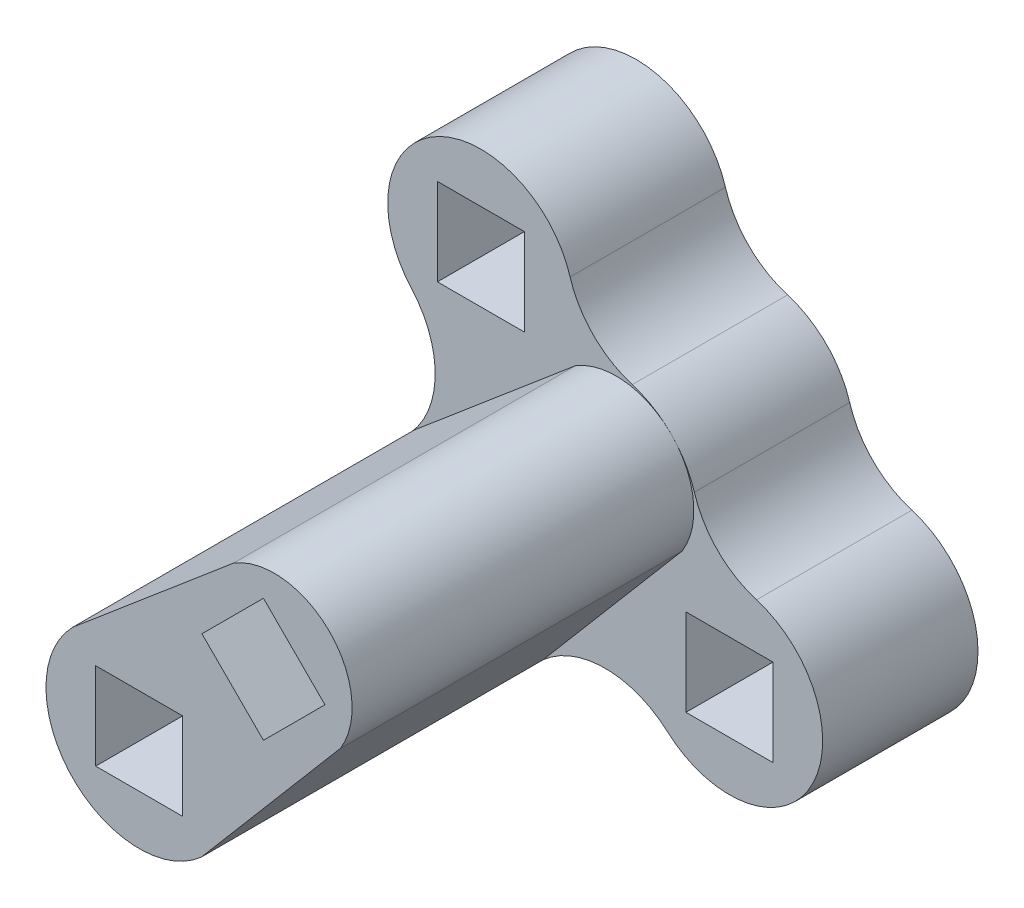
ISO-10303-21;
HEADER;
FILE_DESCRIPTION(('STEP AP214'),'2;1');
FILE_NAME('part.step','',(''),(''),'','','');
FILE_SCHEMA(('AUTOMOTIVE_DESIGN { 1 0 10303 214 1 1 1 1 }'));
ENDSEC;
DATA;
#1=APPLICATION_CONTEXT('core data for automotive mechanical design processes');
#2=APPLICATION_PROTOCOL_DEFINITION('international standard','automotive_design',2000,#1);
#3=PRODUCT_CONTEXT('',#1,'mechanical');
#4=PRODUCT('Part','Part','',(#3));
#5=PRODUCT_RELATED_PRODUCT_CATEGORY('part','',(#4));
#6=PRODUCT_DEFINITION_FORMATION('','',#4);
#7=PRODUCT_DEFINITION_CONTEXT('part definition',#1,'design');
#8=PRODUCT_DEFINITION('design','',#6,#7);
#9=PRODUCT_DEFINITION_SHAPE('','',#8);
#10=(LENGTH_UNIT() NAMED_UNIT(*) SI_UNIT(.MILLI.,.METRE.));
#11=(NAMED_UNIT(*) PLANE_ANGLE_UNIT() SI_UNIT($,.RADIAN.));
#12=(NAMED_UNIT(*) SI_UNIT($,.STERADIAN.) SOLID_ANGLE_UNIT());
#13=UNCERTAINTY_MEASURE_WITH_UNIT(LENGTH_MEASURE(1.E-05),#10,'distance_accuracy_value','');
#14=(GEOMETRIC_REPRESENTATION_CONTEXT(3) GLOBAL_UNCERTAINTY_ASSIGNED_CONTEXT((#13)) GLOBAL_UNIT_ASSIGNED_CONTEXT((#10,
#11,#12)) REPRESENTATION_CONTEXT('',''));
#15=CARTESIAN_POINT('',(0.,0.,0.));
#16=DIRECTION('',(0.,0.,1.));
#17=DIRECTION('',(1.,0.,0.));
#18=AXIS2_PLACEMENT_3D('',#15,#16,#17);
#19=CARTESIAN_POINT('',(2.,-2.23606797749979,16.));
#20=DIRECTION('',(0.,0.,1.));
#21=DIRECTION('',(1.,0.,0.));
#22=AXIS2_PLACEMENT_3D('',#19,#20,#21);
#23=PLANE('',#22);
#24=DIRECTION('',(-0.707106781186549,0.707106781186546,0.));
#25=VECTOR('',#24,1.);
#26=CARTESIAN_POINT('',(4.,5.97989898732234,16.));
#27=LINE('',#26,#25);
#28=CARTESIAN_POINT('',(5.97989898732233,4.00000000000001,16.));
#29=VERTEX_POINT('',#28);
#30=CARTESIAN_POINT('',(4.,5.97989898732234,16.));
#31=VERTEX_POINT('',#30);
#32=EDGE_CURVE('E409',#29,#31,#27,.T.);
#33=ORIENTED_EDGE('',*,*,#32,.F.);
#34=DIRECTION('',(0.707106781186546,0.707106781186549,0.));
#35=VECTOR('',#34,1.);
#36=CARTESIAN_POINT('',(4.,2.02010101267767,16.));
#37=LINE('',#36,#35);
#38=CARTESIAN_POINT('',(4.,2.02010101267767,16.));
#39=VERTEX_POINT('',#38);
#40=EDGE_CURVE('E407',#39,#29,#37,.T.);
#41=ORIENTED_EDGE('',*,*,#40,.F.);
#42=DIRECTION('',(0.707106781186549,-0.707106781186546,0.));
#43=VECTOR('',#42,1.);
#44=CARTESIAN_POINT('',(2.02010101267767,4.,16.));
#45=LINE('',#44,#43);
#46=CARTESIAN_POINT('',(2.02010101267767,4.,16.));
#47=VERTEX_POINT('',#46);
#48=EDGE_CURVE('E415',#47,#39,#45,.T.);
#49=ORIENTED_EDGE('',*,*,#48,.F.);
#50=DIRECTION('',(-0.707106781186546,-0.707106781186549,0.));
#51=VECTOR('',#50,1.);
#52=CARTESIAN_POINT('',(2.02010101267767,4.,16.));
#53=LINE('',#52,#51);
#54=EDGE_CURVE('E412',#31,#47,#53,.T.);
#55=ORIENTED_EDGE('',*,*,#54,.F.);
#56=EDGE_LOOP('',(#33,#41,#49,#55));
#57=FACE_BOUND('',#56,.T.);
#58=DIRECTION('',(0.,1.,0.));
#59=VECTOR('',#58,1.);
#60=CARTESIAN_POINT('',(1.4,1.4,16.));
#61=LINE('',#60,#59);
#62=CARTESIAN_POINT('',(1.4,-1.4,16.));
#63=VERTEX_POINT('',#62);
#64=CARTESIAN_POINT('',(1.4,1.4,16.));
#65=VERTEX_POINT('',#64);
#66=EDGE_CURVE('E358',#63,#65,#61,.T.);
#67=ORIENTED_EDGE('',*,*,#66,.F.);
#68=DIRECTION('',(1.,0.,0.));
#69=VECTOR('',#68,1.);
#70=CARTESIAN_POINT('',(-1.4,-1.4,16.));
#71=LINE('',#70,#69);
#72=CARTESIAN_POINT('',(-1.4,-1.4,16.));
#73=VERTEX_POINT('',#72);
#74=EDGE_CURVE('E356',#73,#63,#71,.T.);
#75=ORIENTED_EDGE('',*,*,#74,.F.);
#76=DIRECTION('',(0.,-1.,0.));
#77=VECTOR('',#76,1.);
#78=CARTESIAN_POINT('',(-1.4,1.4,16.));
#79=LINE('',#78,#77);
#80=CARTESIAN_POINT('',(-1.4,1.4,16.));
#81=VERTEX_POINT('',#80);
#82=EDGE_CURVE('E364',#81,#73,#79,.T.);
#83=ORIENTED_EDGE('',*,*,#82,.F.);
#84=DIRECTION('',(-1.,0.,0.));
#85=VECTOR('',#84,1.);
#86=CARTESIAN_POINT('',(-1.4,1.4,16.));
#87=LINE('',#86,#85);
#88=EDGE_CURVE('E361',#65,#81,#87,.T.);
#89=ORIENTED_EDGE('',*,*,#88,.F.);
#90=EDGE_LOOP('',(#67,#75,#83,#89));
#91=FACE_BOUND('',#90,.T.);
#92=DIRECTION('',(-0.763726121624456,-0.645540402413719,0.));
#93=VECTOR('',#92,1.);
#94=CARTESIAN_POINT('',(3.04273657005169,6.48234630278207,16.));
#95=LINE('',#94,#93);
#96=CARTESIAN_POINT('',(3.04273657005169,6.48234630278207,16.));
#97=VERTEX_POINT('',#96);
#98=CARTESIAN_POINT('',(-2.14481671323412,2.0975607897345,16.));
#99=VERTEX_POINT('',#98);
#100=EDGE_CURVE('E498',#97,#99,#95,.T.);
#101=ORIENTED_EDGE('',*,*,#100,.T.);
#102=CARTESIAN_POINT('',(0.,0.,16.));
#103=DIRECTION('',(0.,0.,1.));
#104=DIRECTION('',(1.,0.,0.));
#105=AXIS2_PLACEMENT_3D('',#102,#103,#104);
#106=CIRCLE('',#105,3.);
#107=CARTESIAN_POINT('',(2.,-2.23606797749979,16.));
#108=VERTEX_POINT('',#107);
#109=EDGE_CURVE('E276',#99,#108,#106,.T.);
#110=ORIENTED_EDGE('',*,*,#109,.T.);
#111=DIRECTION('',(0.647457578645489,0.762101491833286,0.));
#112=VECTOR('',#111,1.);
#113=CARTESIAN_POINT('',(2.,-2.23606797749979,16.));
#114=LINE('',#113,#112);
#115=CARTESIAN_POINT('',(6.47600505006758,3.03249360648251,16.));
#116=VERTEX_POINT('',#115);
#117=EDGE_CURVE('E247',#108,#116,#114,.T.);
#118=ORIENTED_EDGE('',*,*,#117,.T.);
#119=CARTESIAN_POINT('',(4.35355339059327,4.35355339059328,16.));
#120=DIRECTION('',(0.,0.,1.));
#121=DIRECTION('',(1.,0.,0.));
#122=AXIS2_PLACEMENT_3D('',#119,#120,#121);
#123=CIRCLE('',#122,2.5);
#124=EDGE_CURVE('E496',#116,#97,#123,.T.);
#125=ORIENTED_EDGE('',*,*,#124,.T.);
#126=EDGE_LOOP('',(#101,#110,#118,#125));
#127=FACE_BOUND('',#126,.T.);
#128=ADVANCED_FACE('F58',(#57,#91,#127),#23,.T.);
#129=CARTESIAN_POINT('',(4.,-4.47213595499958,16.));
#130=DIRECTION('',(0.,0.,-1.));
#131=DIRECTION('',(-1.,0.,0.));
#132=AXIS2_PLACEMENT_3D('',#129,#130,#131);
#133=CYLINDRICAL_SURFACE('',#132,3.);
#134=CARTESIAN_POINT('',(4.,-4.47213595499958,5.));
#135=DIRECTION('',(0.,0.,1.));
#136=DIRECTION('',(1.,0.,0.));
#137=AXIS2_PLACEMENT_3D('',#134,#135,#136);
#138=CIRCLE('',#137,3.);
#139=CARTESIAN_POINT('',(2.,-2.23606797749979,5.));
#140=VERTEX_POINT('',#139);
#141=CARTESIAN_POINT('',(6.,-2.23606797749979,5.));
#142=VERTEX_POINT('',#141);
#143=EDGE_CURVE('E257',#140,#142,#138,.F.);
#144=ORIENTED_EDGE('',*,*,#143,.F.);
#145=DIRECTION('',(0.,0.,-1.));
#146=VECTOR('',#145,1.);
#147=CARTESIAN_POINT('',(2.,-2.23606797749979,16.));
#148=LINE('',#147,#146);
#149=CARTESIAN_POINT('',(2.,-2.23606797749979,0.));
#150=VERTEX_POINT('',#149);
#151=EDGE_CURVE('E252',#140,#150,#148,.T.);
#152=ORIENTED_EDGE('',*,*,#151,.T.);
#153=CARTESIAN_POINT('',(4.,-4.47213595499958,0.));
#154=DIRECTION('',(0.,0.,-1.));
#155=DIRECTION('',(1.,0.,0.));
#156=AXIS2_PLACEMENT_3D('',#153,#154,#155);
#157=CIRCLE('',#156,3.);
#158=CARTESIAN_POINT('',(6.,-2.23606797749979,0.));
#159=VERTEX_POINT('',#158);
#160=EDGE_CURVE('E301',#150,#159,#157,.T.);
#161=ORIENTED_EDGE('',*,*,#160,.T.);
#162=DIRECTION('',(0.,0.,-1.));
#163=VECTOR('',#162,1.);
#164=CARTESIAN_POINT('',(6.,-2.23606797749979,16.));
#165=LINE('',#164,#163);
#166=EDGE_CURVE('E66',#142,#159,#165,.T.);
#167=ORIENTED_EDGE('',*,*,#166,.F.);
#168=EDGE_LOOP('',(#144,#152,#161,#167));
#169=FACE_BOUND('',#168,.T.);
#170=ADVANCED_FACE('F60',(#169),#133,.F.);
#171=CARTESIAN_POINT('',(8.,0.,16.));
#172=DIRECTION('',(0.,0.,-1.));
#173=DIRECTION('',(-1.,0.,0.));
#174=AXIS2_PLACEMENT_3D('',#171,#172,#173);
#175=CYLINDRICAL_SURFACE('',#174,3.);
#176=CARTESIAN_POINT('',(8.,0.,5.));
#177=DIRECTION('',(0.,0.,1.));
#178=DIRECTION('',(1.,0.,0.));
#179=AXIS2_PLACEMENT_3D('',#176,#177,#178);
#180=CIRCLE('',#179,3.);
#181=CARTESIAN_POINT('',(8.87082869338697,2.87082869338697,5.));
#182=VERTEX_POINT('',#181);
#183=EDGE_CURVE('E270',#142,#182,#180,.T.);
#184=ORIENTED_EDGE('',*,*,#183,.F.);
#185=ORIENTED_EDGE('',*,*,#166,.T.);
#186=CARTESIAN_POINT('',(8.,0.,0.));
#187=DIRECTION('',(0.,0.,1.));
#188=DIRECTION('',(1.,0.,0.));
#189=AXIS2_PLACEMENT_3D('',#186,#187,#188);
#190=CIRCLE('',#189,3.);
#191=CARTESIAN_POINT('',(8.87082869338697,2.87082869338697,0.));
#192=VERTEX_POINT('',#191);
#193=EDGE_CURVE('E296',#159,#192,#190,.T.);
#194=ORIENTED_EDGE('',*,*,#193,.T.);
#195=DIRECTION('',(0.,0.,-1.));
#196=VECTOR('',#195,1.);
#197=CARTESIAN_POINT('',(8.87082869338697,2.87082869338697,16.));
#198=LINE('',#197,#196);
#199=EDGE_CURVE('E290',#182,#192,#198,.T.);
#200=ORIENTED_EDGE('',*,*,#199,.F.);
#201=EDGE_LOOP('',(#184,#185,#194,#200));
#202=FACE_BOUND('',#201,.T.);
#203=ADVANCED_FACE('F294',(#202),#175,.T.);
#204=CARTESIAN_POINT('',(9.74165738677394,5.74165738677394,16.));
#205=DIRECTION('',(0.,0.,-1.));
#206=DIRECTION('',(-1.,0.,0.));
#207=AXIS2_PLACEMENT_3D('',#204,#205,#206);
#208=CYLINDRICAL_SURFACE('',#207,3.);
#209=CARTESIAN_POINT('',(9.74165738677394,5.74165738677394,5.));
#210=DIRECTION('',(0.,0.,1.));
#211=DIRECTION('',(1.,0.,0.));
#212=AXIS2_PLACEMENT_3D('',#209,#210,#211);
#213=CIRCLE('',#212,3.);
#214=CARTESIAN_POINT('',(6.87082869338697,4.87082869338697,5.));
#215=VERTEX_POINT('',#214);
#216=EDGE_CURVE('E349',#182,#215,#213,.F.);
#217=ORIENTED_EDGE('',*,*,#216,.F.);
#218=ORIENTED_EDGE('',*,*,#199,.T.);
#219=CARTESIAN_POINT('',(9.74165738677394,5.74165738677394,0.));
#220=DIRECTION('',(0.,0.,-1.));
#221=DIRECTION('',(1.,0.,0.));
#222=AXIS2_PLACEMENT_3D('',#219,#220,#221);
#223=CIRCLE('',#222,3.);
#224=CARTESIAN_POINT('',(6.87082869338697,4.87082869338697,0.));
#225=VERTEX_POINT('',#224);
#226=EDGE_CURVE('E304',#192,#225,#223,.T.);
#227=ORIENTED_EDGE('',*,*,#226,.T.);
#228=DIRECTION('',(0.,0.,-1.));
#229=VECTOR('',#228,1.);
#230=CARTESIAN_POINT('',(6.87082869338697,4.87082869338697,16.));
#231=LINE('',#230,#229);
#232=EDGE_CURVE('E288',#215,#225,#231,.T.);
#233=ORIENTED_EDGE('',*,*,#232,.F.);
#234=EDGE_LOOP('',(#217,#218,#227,#233));
#235=FACE_BOUND('',#234,.T.);
#236=ADVANCED_FACE('F348',(#235),#208,.F.);
#237=CARTESIAN_POINT('',(4.,4.,16.));
#238=DIRECTION('',(0.,0.,-1.));
#239=DIRECTION('',(-1.,0.,0.));
#240=AXIS2_PLACEMENT_3D('',#237,#238,#239);
#241=CYLINDRICAL_SURFACE('',#240,3.);
#242=CARTESIAN_POINT('',(4.,4.,5.));
#243=DIRECTION('',(0.,0.,1.));
#244=DIRECTION('',(1.,0.,0.));
#245=AXIS2_PLACEMENT_3D('',#242,#243,#244);
#246=CIRCLE('',#245,3.);
#247=CARTESIAN_POINT('',(6.12132034355963,6.12132034355965,5.));
#248=VERTEX_POINT('',#247);
#249=CARTESIAN_POINT('',(4.87082869338697,6.87082869338697,5.));
#250=VERTEX_POINT('',#249);
#251=EDGE_CURVE('E352',#248,#250,#246,.T.);
#252=ORIENTED_EDGE('',*,*,#251,.F.);
#253=EDGE_CURVE('E345',#215,#248,#246,.T.);
#254=ORIENTED_EDGE('',*,*,#253,.F.);
#255=ORIENTED_EDGE('',*,*,#232,.T.);
#256=CARTESIAN_POINT('',(4.,4.,0.));
#257=DIRECTION('',(0.,0.,1.));
#258=DIRECTION('',(1.,0.,0.));
#259=AXIS2_PLACEMENT_3D('',#256,#257,#258);
#260=CIRCLE('',#259,3.);
#261=CARTESIAN_POINT('',(4.87082869338697,6.87082869338697,0.));
#262=VERTEX_POINT('',#261);
#263=EDGE_CURVE('E312',#225,#262,#260,.T.);
#264=ORIENTED_EDGE('',*,*,#263,.T.);
#265=DIRECTION('',(0.,0.,-1.));
#266=VECTOR('',#265,1.);
#267=CARTESIAN_POINT('',(4.87082869338697,6.87082869338697,16.));
#268=LINE('',#267,#266);
#269=EDGE_CURVE('E286',#250,#262,#268,.T.);
#270=ORIENTED_EDGE('',*,*,#269,.F.);
#271=EDGE_LOOP('',(#252,#254,#255,#264,#270));
#272=FACE_BOUND('',#271,.T.);
#273=ADVANCED_FACE('F342',(#272),#241,.T.);
#274=CARTESIAN_POINT('',(5.74165738677394,9.74165738677394,16.));
#275=DIRECTION('',(0.,0.,-1.));
#276=DIRECTION('',(-1.,0.,0.));
#277=AXIS2_PLACEMENT_3D('',#274,#275,#276);
#278=CYLINDRICAL_SURFACE('',#277,3.);
#279=CARTESIAN_POINT('',(5.74165738677394,9.74165738677394,5.));
#280=DIRECTION('',(0.,0.,1.));
#281=DIRECTION('',(1.,0.,0.));
#282=AXIS2_PLACEMENT_3D('',#279,#280,#281);
#283=CIRCLE('',#282,3.);
#284=CARTESIAN_POINT('',(2.87082869338697,8.87082869338697,5.));
#285=VERTEX_POINT('',#284);
#286=EDGE_CURVE('E339',#250,#285,#283,.F.);
#287=ORIENTED_EDGE('',*,*,#286,.F.);
#288=ORIENTED_EDGE('',*,*,#269,.T.);
#289=CARTESIAN_POINT('',(5.74165738677394,9.74165738677394,0.));
#290=DIRECTION('',(0.,0.,-1.));
#291=DIRECTION('',(1.,0.,0.));
#292=AXIS2_PLACEMENT_3D('',#289,#290,#291);
#293=CIRCLE('',#292,3.);
#294=CARTESIAN_POINT('',(2.87082869338697,8.87082869338697,0.));
#295=VERTEX_POINT('',#294);
#296=EDGE_CURVE('E315',#262,#295,#293,.T.);
#297=ORIENTED_EDGE('',*,*,#296,.T.);
#298=DIRECTION('',(0.,0.,-1.));
#299=VECTOR('',#298,1.);
#300=CARTESIAN_POINT('',(2.87082869338697,8.87082869338697,16.));
#301=LINE('',#300,#299);
#302=EDGE_CURVE('E284',#285,#295,#301,.T.);
#303=ORIENTED_EDGE('',*,*,#302,.F.);
#304=EDGE_LOOP('',(#287,#288,#297,#303));
#305=FACE_BOUND('',#304,.T.);
#306=ADVANCED_FACE('F337',(#305),#278,.F.);
#307=CARTESIAN_POINT('',(0.,8.,16.));
#308=DIRECTION('',(0.,0.,-1.));
#309=DIRECTION('',(-1.,0.,0.));
#310=AXIS2_PLACEMENT_3D('',#307,#308,#309);
#311=CYLINDRICAL_SURFACE('',#310,3.);
#312=CARTESIAN_POINT('',(0.,8.,5.));
#313=DIRECTION('',(0.,0.,1.));
#314=DIRECTION('',(1.,0.,0.));
#315=AXIS2_PLACEMENT_3D('',#312,#313,#314);
#316=CIRCLE('',#315,3.);
#317=CARTESIAN_POINT('',(-2.23606797749979,6.,5.));
#318=VERTEX_POINT('',#317);
#319=EDGE_CURVE('E334',#285,#318,#316,.T.);
#320=ORIENTED_EDGE('',*,*,#319,.F.);
#321=ORIENTED_EDGE('',*,*,#302,.T.);
#322=CARTESIAN_POINT('',(0.,8.,0.));
#323=DIRECTION('',(0.,0.,1.));
#324=DIRECTION('',(1.,0.,0.));
#325=AXIS2_PLACEMENT_3D('',#322,#323,#324);
#326=CIRCLE('',#325,3.);
#327=CARTESIAN_POINT('',(-2.23606797749979,6.,0.));
#328=VERTEX_POINT('',#327);
#329=EDGE_CURVE('E318',#295,#328,#326,.T.);
#330=ORIENTED_EDGE('',*,*,#329,.T.);
#331=DIRECTION('',(0.,0.,-1.));
#332=VECTOR('',#331,1.);
#333=CARTESIAN_POINT('',(-2.23606797749979,6.,16.));
#334=LINE('',#333,#332);
#335=EDGE_CURVE('E282',#318,#328,#334,.T.);
#336=ORIENTED_EDGE('',*,*,#335,.F.);
#337=EDGE_LOOP('',(#320,#321,#330,#336));
#338=FACE_BOUND('',#337,.T.);
#339=ADVANCED_FACE('F332',(#338),#311,.T.);
#340=CARTESIAN_POINT('',(-4.47213595499958,4.,16.));
#341=DIRECTION('',(0.,0.,-1.));
#342=DIRECTION('',(-1.,0.,0.));
#343=AXIS2_PLACEMENT_3D('',#340,#341,#342);
#344=CYLINDRICAL_SURFACE('',#343,3.);
#345=CARTESIAN_POINT('',(-4.47213595499958,4.,5.));
#346=DIRECTION('',(0.,0.,1.));
#347=DIRECTION('',(1.,0.,0.));
#348=AXIS2_PLACEMENT_3D('',#345,#346,#347);
#349=CIRCLE('',#348,3.);
#350=CARTESIAN_POINT('',(-2.23606797749979,2.,5.));
#351=VERTEX_POINT('',#350);
#352=EDGE_CURVE('E471',#318,#351,#349,.F.);
#353=ORIENTED_EDGE('',*,*,#352,.F.);
#354=ORIENTED_EDGE('',*,*,#335,.T.);
#355=CARTESIAN_POINT('',(-4.47213595499958,4.,0.));
#356=DIRECTION('',(0.,0.,-1.));
#357=DIRECTION('',(1.,0.,0.));
#358=AXIS2_PLACEMENT_3D('',#355,#356,#357);
#359=CIRCLE('',#358,3.);
#360=CARTESIAN_POINT('',(-2.23606797749979,2.,0.));
#361=VERTEX_POINT('',#360);
#362=EDGE_CURVE('E320',#328,#361,#359,.T.);
#363=ORIENTED_EDGE('',*,*,#362,.T.);
#364=DIRECTION('',(0.,0.,-1.));
#365=VECTOR('',#364,1.);
#366=CARTESIAN_POINT('',(-2.23606797749979,2.,16.));
#367=LINE('',#366,#365);
#368=EDGE_CURVE('E251',#351,#361,#367,.T.);
#369=ORIENTED_EDGE('',*,*,#368,.F.);
#370=EDGE_LOOP('',(#353,#354,#363,#369));
#371=FACE_BOUND('',#370,.T.);
#372=ADVANCED_FACE('F326',(#371),#344,.F.);
#373=CARTESIAN_POINT('',(-1.4,6.6,16.));
#374=DIRECTION('',(0.,1.,0.));
#375=DIRECTION('',(0.,0.,1.));
#376=AXIS2_PLACEMENT_3D('',#373,#374,#375);
#377=PLANE('',#376);
#378=DIRECTION('',(0.,0.,-1.));
#379=VECTOR('',#378,1.);
#380=CARTESIAN_POINT('',(-1.4,6.6,16.));
#381=LINE('',#380,#379);
#382=CARTESIAN_POINT('',(-1.4,6.6,5.));
#383=VERTEX_POINT('',#382);
#384=CARTESIAN_POINT('',(-1.4,6.6,0.));
#385=VERTEX_POINT('',#384);
#386=EDGE_CURVE('E449',#383,#385,#381,.T.);
#387=ORIENTED_EDGE('',*,*,#386,.F.);
#388=DIRECTION('',(1.,0.,0.));
#389=VECTOR('',#388,1.);
#390=CARTESIAN_POINT('',(-1.4,6.6,5.));
#391=LINE('',#390,#389);
#392=CARTESIAN_POINT('',(1.4,6.6,5.));
#393=VERTEX_POINT('',#392);
#394=EDGE_CURVE('E73',#383,#393,#391,.T.);
#395=ORIENTED_EDGE('',*,*,#394,.T.);
#396=DIRECTION('',(0.,0.,-1.));
#397=VECTOR('',#396,1.);
#398=CARTESIAN_POINT('',(1.4,6.6,16.));
#399=LINE('',#398,#397);
#400=CARTESIAN_POINT('',(1.4,6.6,0.));
#401=VERTEX_POINT('',#400);
#402=EDGE_CURVE('E306',#393,#401,#399,.T.);
#403=ORIENTED_EDGE('',*,*,#402,.T.);
#404=DIRECTION('',(1.,0.,0.));
#405=VECTOR('',#404,1.);
#406=CARTESIAN_POINT('',(-1.4,6.6,0.));
#407=LINE('',#406,#405);
#408=EDGE_CURVE('E437',#385,#401,#407,.T.);
#409=ORIENTED_EDGE('',*,*,#408,.F.);
#410=EDGE_LOOP('',(#387,#395,#403,#409));
#411=FACE_BOUND('',#410,.T.);
#412=ADVANCED_FACE('F470',(#411),#377,.T.);
#413=CARTESIAN_POINT('',(1.4,9.4,16.));
#414=DIRECTION('',(-1.,0.,0.));
#415=DIRECTION('',(0.,0.,1.));
#416=AXIS2_PLACEMENT_3D('',#413,#414,#415);
#417=PLANE('',#416);
#418=ORIENTED_EDGE('',*,*,#402,.F.);
#419=DIRECTION('',(0.,1.,0.));
#420=VECTOR('',#419,1.);
#421=CARTESIAN_POINT('',(1.4,9.4,5.));
#422=LINE('',#421,#420);
#423=CARTESIAN_POINT('',(1.4,9.4,5.));
#424=VERTEX_POINT('',#423);
#425=EDGE_CURVE('E460',#393,#424,#422,.T.);
#426=ORIENTED_EDGE('',*,*,#425,.T.);
#427=DIRECTION('',(0.,0.,-1.));
#428=VECTOR('',#427,1.);
#429=CARTESIAN_POINT('',(1.4,9.4,16.));
#430=LINE('',#429,#428);
#431=CARTESIAN_POINT('',(1.4,9.4,0.));
#432=VERTEX_POINT('',#431);
#433=EDGE_CURVE('E308',#424,#432,#430,.T.);
#434=ORIENTED_EDGE('',*,*,#433,.T.);
#435=DIRECTION('',(0.,1.,0.));
#436=VECTOR('',#435,1.);
#437=CARTESIAN_POINT('',(1.4,9.4,0.));
#438=LINE('',#437,#436);
#439=EDGE_CURVE('E440',#401,#432,#438,.T.);
#440=ORIENTED_EDGE('',*,*,#439,.F.);
#441=EDGE_LOOP('',(#418,#426,#434,#440));
#442=FACE_BOUND('',#441,.T.);
#443=ADVANCED_FACE('F459',(#442),#417,.T.);
#444=CARTESIAN_POINT('',(-1.4,9.4,16.));
#445=DIRECTION('',(0.,-1.,0.));
#446=DIRECTION('',(0.,0.,-1.));
#447=AXIS2_PLACEMENT_3D('',#444,#445,#446);
#448=PLANE('',#447);
#449=ORIENTED_EDGE('',*,*,#433,.F.);
#450=DIRECTION('',(-1.,0.,0.));
#451=VECTOR('',#450,1.);
#452=CARTESIAN_POINT('',(-1.4,9.4,5.));
#453=LINE('',#452,#451);
#454=CARTESIAN_POINT('',(-1.4,9.4,5.));
#455=VERTEX_POINT('',#454);
#456=EDGE_CURVE('E474',#424,#455,#453,.T.);
#457=ORIENTED_EDGE('',*,*,#456,.T.);
#458=DIRECTION('',(0.,0.,-1.));
#459=VECTOR('',#458,1.);
#460=CARTESIAN_POINT('',(-1.4,9.4,16.));
#461=LINE('',#460,#459);
#462=CARTESIAN_POINT('',(-1.4,9.4,0.));
#463=VERTEX_POINT('',#462);
#464=EDGE_CURVE('E451',#455,#463,#461,.T.);
#465=ORIENTED_EDGE('',*,*,#464,.T.);
#466=DIRECTION('',(-1.,0.,0.));
#467=VECTOR('',#466,1.);
#468=CARTESIAN_POINT('',(-1.4,9.4,0.));
#469=LINE('',#468,#467);
#470=EDGE_CURVE('E443',#432,#463,#469,.T.);
#471=ORIENTED_EDGE('',*,*,#470,.F.);
#472=EDGE_LOOP('',(#449,#457,#465,#471));
#473=FACE_BOUND('',#472,.T.);
#474=ADVANCED_FACE('F463',(#473),#448,.T.);
#475=CARTESIAN_POINT('',(-1.4,9.4,16.));
#476=DIRECTION('',(1.,0.,0.));
#477=DIRECTION('',(0.,1.,0.));
#478=AXIS2_PLACEMENT_3D('',#475,#476,#477);
#479=PLANE('',#478);
#480=ORIENTED_EDGE('',*,*,#464,.F.);
#481=DIRECTION('',(0.,-1.,0.));
#482=VECTOR('',#481,1.);
#483=CARTESIAN_POINT('',(-1.4,9.4,5.));
#484=LINE('',#483,#482);
#485=EDGE_CURVE('E514',#455,#383,#484,.T.);
#486=ORIENTED_EDGE('',*,*,#485,.T.);
#487=ORIENTED_EDGE('',*,*,#386,.T.);
#488=DIRECTION('',(0.,-1.,0.));
#489=VECTOR('',#488,1.);
#490=CARTESIAN_POINT('',(-1.4,9.4,0.));
#491=LINE('',#490,#489);
#492=EDGE_CURVE('E446',#463,#385,#491,.T.);
#493=ORIENTED_EDGE('',*,*,#492,.F.);
#494=EDGE_LOOP('',(#480,#486,#487,#493));
#495=FACE_BOUND('',#494,.T.);
#496=ADVANCED_FACE('F516',(#495),#479,.T.);
#497=CARTESIAN_POINT('',(6.6,-1.4,16.));
#498=DIRECTION('',(0.,1.,0.));
#499=DIRECTION('',(0.,0.,1.));
#500=AXIS2_PLACEMENT_3D('',#497,#498,#499);
#501=PLANE('',#500);
#502=DIRECTION('',(0.,0.,-1.));
#503=VECTOR('',#502,1.);
#504=CARTESIAN_POINT('',(6.6,-1.4,16.));
#505=LINE('',#504,#503);
#506=CARTESIAN_POINT('',(6.6,-1.4,5.));
#507=VERTEX_POINT('',#506);
#508=CARTESIAN_POINT('',(6.6,-1.4,0.));
#509=VERTEX_POINT('',#508);
#510=EDGE_CURVE('E398',#507,#509,#505,.T.);
#511=ORIENTED_EDGE('',*,*,#510,.F.);
#512=DIRECTION('',(1.,0.,0.));
#513=VECTOR('',#512,1.);
#514=CARTESIAN_POINT('',(6.6,-1.4,5.));
#515=LINE('',#514,#513);
#516=CARTESIAN_POINT('',(9.4,-1.4,5.));
#517=VERTEX_POINT('',#516);
#518=EDGE_CURVE('E81',#507,#517,#515,.T.);
#519=ORIENTED_EDGE('',*,*,#518,.T.);
#520=DIRECTION('',(0.,0.,-1.));
#521=VECTOR('',#520,1.);
#522=CARTESIAN_POINT('',(9.4,-1.4,16.));
#523=LINE('',#522,#521);
#524=CARTESIAN_POINT('',(9.4,-1.4,0.));
#525=VERTEX_POINT('',#524);
#526=EDGE_CURVE('E404',#517,#525,#523,.T.);
#527=ORIENTED_EDGE('',*,*,#526,.T.);
#528=DIRECTION('',(1.,0.,0.));
#529=VECTOR('',#528,1.);
#530=CARTESIAN_POINT('',(6.6,-1.4,0.));
#531=LINE('',#530,#529);
#532=EDGE_CURVE('E386',#509,#525,#531,.T.);
#533=ORIENTED_EDGE('',*,*,#532,.F.);
#534=EDGE_LOOP('',(#511,#519,#527,#533));
#535=FACE_BOUND('',#534,.T.);
#536=ADVANCED_FACE('F602',(#535),#501,.T.);
#537=CARTESIAN_POINT('',(9.4,1.4,16.));
#538=DIRECTION('',(-1.,0.,0.));
#539=DIRECTION('',(0.,0.,1.));
#540=AXIS2_PLACEMENT_3D('',#537,#538,#539);
#541=PLANE('',#540);
#542=ORIENTED_EDGE('',*,*,#526,.F.);
#543=DIRECTION('',(0.,1.,0.));
#544=VECTOR('',#543,1.);
#545=CARTESIAN_POINT('',(9.4,1.4,5.));
#546=LINE('',#545,#544);
#547=CARTESIAN_POINT('',(9.4,1.4,5.));
#548=VERTEX_POINT('',#547);
#549=EDGE_CURVE('E510',#517,#548,#546,.T.);
#550=ORIENTED_EDGE('',*,*,#549,.T.);
#551=DIRECTION('',(0.,0.,-1.));
#552=VECTOR('',#551,1.);
#553=CARTESIAN_POINT('',(9.4,1.4,16.));
#554=LINE('',#553,#552);
#555=CARTESIAN_POINT('',(9.4,1.4,0.));
#556=VERTEX_POINT('',#555);
#557=EDGE_CURVE('E402',#548,#556,#554,.T.);
#558=ORIENTED_EDGE('',*,*,#557,.T.);
#559=DIRECTION('',(0.,1.,0.));
#560=VECTOR('',#559,1.);
#561=CARTESIAN_POINT('',(9.4,1.4,0.));
#562=LINE('',#561,#560);
#563=EDGE_CURVE('E389',#525,#556,#562,.T.);
#564=ORIENTED_EDGE('',*,*,#563,.F.);
#565=EDGE_LOOP('',(#542,#550,#558,#564));
#566=FACE_BOUND('',#565,.T.);
#567=ADVANCED_FACE('F609',(#566),#541,.T.);
#568=CARTESIAN_POINT('',(6.6,1.4,16.));
#569=DIRECTION('',(0.,-1.,0.));
#570=DIRECTION('',(0.,0.,-1.));
#571=AXIS2_PLACEMENT_3D('',#568,#569,#570);
#572=PLANE('',#571);
#573=ORIENTED_EDGE('',*,*,#557,.F.);
#574=DIRECTION('',(-1.,0.,0.));
#575=VECTOR('',#574,1.);
#576=CARTESIAN_POINT('',(6.6,1.4,5.));
#577=LINE('',#576,#575);
#578=CARTESIAN_POINT('',(6.6,1.4,5.));
#579=VERTEX_POINT('',#578);
#580=EDGE_CURVE('E504',#548,#579,#577,.T.);
#581=ORIENTED_EDGE('',*,*,#580,.T.);
#582=DIRECTION('',(0.,0.,-1.));
#583=VECTOR('',#582,1.);
#584=CARTESIAN_POINT('',(6.6,1.4,16.));
#585=LINE('',#584,#583);
#586=CARTESIAN_POINT('',(6.6,1.4,0.));
#587=VERTEX_POINT('',#586);
#588=EDGE_CURVE('E400',#579,#587,#585,.T.);
#589=ORIENTED_EDGE('',*,*,#588,.T.);
#590=DIRECTION('',(-1.,0.,0.));
#591=VECTOR('',#590,1.);
#592=CARTESIAN_POINT('',(6.6,1.4,0.));
#593=LINE('',#592,#591);
#594=EDGE_CURVE('E392',#556,#587,#593,.T.);
#595=ORIENTED_EDGE('',*,*,#594,.F.);
#596=EDGE_LOOP('',(#573,#581,#589,#595));
#597=FACE_BOUND('',#596,.T.);
#598=ADVANCED_FACE('F617',(#597),#572,.T.);
#599=CARTESIAN_POINT('',(6.6,1.4,16.));
#600=DIRECTION('',(1.,0.,0.));
#601=DIRECTION('',(0.,1.,0.));
#602=AXIS2_PLACEMENT_3D('',#599,#600,#601);
#603=PLANE('',#602);
#604=ORIENTED_EDGE('',*,*,#588,.F.);
#605=DIRECTION('',(0.,-1.,0.));
#606=VECTOR('',#605,1.);
#607=CARTESIAN_POINT('',(6.6,1.4,5.));
#608=LINE('',#607,#606);
#609=EDGE_CURVE('E12',#579,#507,#608,.T.);
#610=ORIENTED_EDGE('',*,*,#609,.T.);
#611=ORIENTED_EDGE('',*,*,#510,.T.);
#612=DIRECTION('',(0.,-1.,0.));
#613=VECTOR('',#612,1.);
#614=CARTESIAN_POINT('',(6.6,1.4,0.));
#615=LINE('',#614,#613);
#616=EDGE_CURVE('E395',#587,#509,#615,.T.);
#617=ORIENTED_EDGE('',*,*,#616,.F.);
#618=EDGE_LOOP('',(#604,#610,#611,#617));
#619=FACE_BOUND('',#618,.T.);
#620=ADVANCED_FACE('F541',(#619),#603,.T.);
#621=CARTESIAN_POINT('',(2.,-2.23606797749979,0.));
#622=DIRECTION('',(0.,0.,1.));
#623=DIRECTION('',(1.,0.,0.));
#624=AXIS2_PLACEMENT_3D('',#621,#622,#623);
#625=PLANE('',#624);
#626=ORIENTED_EDGE('',*,*,#532,.T.);
#627=ORIENTED_EDGE('',*,*,#563,.T.);
#628=ORIENTED_EDGE('',*,*,#594,.T.);
#629=ORIENTED_EDGE('',*,*,#616,.T.);
#630=EDGE_LOOP('',(#626,#627,#628,#629));
#631=FACE_BOUND('',#630,.T.);
#632=ORIENTED_EDGE('',*,*,#408,.T.);
#633=ORIENTED_EDGE('',*,*,#439,.T.);
#634=ORIENTED_EDGE('',*,*,#470,.T.);
#635=ORIENTED_EDGE('',*,*,#492,.T.);
#636=EDGE_LOOP('',(#632,#633,#634,#635));
#637=FACE_BOUND('',#636,.T.);
#638=ORIENTED_EDGE('',*,*,#160,.F.);
#639=CARTESIAN_POINT('',(0.,0.,0.));
#640=DIRECTION('',(0.,0.,1.));
#641=DIRECTION('',(1.,0.,0.));
#642=AXIS2_PLACEMENT_3D('',#639,#640,#641);
#643=CIRCLE('',#642,3.);
#644=EDGE_CURVE('E274',#361,#150,#643,.T.);
#645=ORIENTED_EDGE('',*,*,#644,.F.);
#646=ORIENTED_EDGE('',*,*,#362,.F.);
#647=ORIENTED_EDGE('',*,*,#329,.F.);
#648=ORIENTED_EDGE('',*,*,#296,.F.);
#649=ORIENTED_EDGE('',*,*,#263,.F.);
#650=ORIENTED_EDGE('',*,*,#226,.F.);
#651=ORIENTED_EDGE('',*,*,#193,.F.);
#652=EDGE_LOOP('',(#638,#645,#646,#647,#648,#649,#650,#651));
#653=FACE_BOUND('',#652,.T.);
#654=DIRECTION('',(0.707106781186546,0.707106781186549,0.));
#655=VECTOR('',#654,1.);
#656=CARTESIAN_POINT('',(4.,2.02010101267767,0.));
#657=LINE('',#656,#655);
#658=CARTESIAN_POINT('',(4.,2.02010101267767,0.));
#659=VERTEX_POINT('',#658);
#660=CARTESIAN_POINT('',(5.97989898732233,4.00000000000001,0.));
#661=VERTEX_POINT('',#660);
#662=EDGE_CURVE('E406',#659,#661,#657,.T.);
#663=ORIENTED_EDGE('',*,*,#662,.T.);
#664=DIRECTION('',(-0.707106781186549,0.707106781186546,0.));
#665=VECTOR('',#664,1.);
#666=CARTESIAN_POINT('',(4.,5.97989898732234,0.));
#667=LINE('',#666,#665);
#668=CARTESIAN_POINT('',(4.,5.97989898732234,0.));
#669=VERTEX_POINT('',#668);
#670=EDGE_CURVE('E420',#661,#669,#667,.T.);
#671=ORIENTED_EDGE('',*,*,#670,.T.);
#672=DIRECTION('',(-0.707106781186546,-0.707106781186549,0.));
#673=VECTOR('',#672,1.);
#674=CARTESIAN_POINT('',(2.02010101267767,4.,0.));
#675=LINE('',#674,#673);
#676=CARTESIAN_POINT('',(2.02010101267767,4.,0.));
#677=VERTEX_POINT('',#676);
#678=EDGE_CURVE('E423',#669,#677,#675,.T.);
#679=ORIENTED_EDGE('',*,*,#678,.T.);
#680=DIRECTION('',(0.707106781186549,-0.707106781186546,0.));
#681=VECTOR('',#680,1.);
#682=CARTESIAN_POINT('',(2.02010101267767,4.,0.));
#683=LINE('',#682,#681);
#684=EDGE_CURVE('E410',#677,#659,#683,.T.);
#685=ORIENTED_EDGE('',*,*,#684,.T.);
#686=EDGE_LOOP('',(#663,#671,#679,#685));
#687=FACE_BOUND('',#686,.T.);
#688=DIRECTION('',(1.,0.,0.));
#689=VECTOR('',#688,1.);
#690=CARTESIAN_POINT('',(-1.4,-1.4,0.));
#691=LINE('',#690,#689);
#692=CARTESIAN_POINT('',(-1.4,-1.4,0.));
#693=VERTEX_POINT('',#692);
#694=CARTESIAN_POINT('',(1.4,-1.4,0.));
#695=VERTEX_POINT('',#694);
#696=EDGE_CURVE('E269',#693,#695,#691,.T.);
#697=ORIENTED_EDGE('',*,*,#696,.T.);
#698=DIRECTION('',(0.,1.,0.));
#699=VECTOR('',#698,1.);
#700=CARTESIAN_POINT('',(1.4,1.4,0.));
#701=LINE('',#700,#699);
#702=CARTESIAN_POINT('',(1.4,1.4,0.));
#703=VERTEX_POINT('',#702);
#704=EDGE_CURVE('E369',#695,#703,#701,.T.);
#705=ORIENTED_EDGE('',*,*,#704,.T.);
#706=DIRECTION('',(-1.,0.,0.));
#707=VECTOR('',#706,1.);
#708=CARTESIAN_POINT('',(-1.4,1.4,0.));
#709=LINE('',#708,#707);
#710=CARTESIAN_POINT('',(-1.4,1.4,0.));
#711=VERTEX_POINT('',#710);
#712=EDGE_CURVE('E372',#703,#711,#709,.T.);
#713=ORIENTED_EDGE('',*,*,#712,.T.);
#714=DIRECTION('',(0.,-1.,0.));
#715=VECTOR('',#714,1.);
#716=CARTESIAN_POINT('',(-1.4,1.4,0.));
#717=LINE('',#716,#715);
#718=EDGE_CURVE('E359',#711,#693,#717,.T.);
#719=ORIENTED_EDGE('',*,*,#718,.T.);
#720=EDGE_LOOP('',(#697,#705,#713,#719));
#721=FACE_BOUND('',#720,.T.);
#722=ADVANCED_FACE('F299',(#631,#637,#653,#687,#721),#625,.F.);
#723=CARTESIAN_POINT('',(0.,0.,16.));
#724=DIRECTION('',(0.,0.,-1.));
#725=DIRECTION('',(-1.,0.,0.));
#726=AXIS2_PLACEMENT_3D('',#723,#724,#725);
#727=CYLINDRICAL_SURFACE('',#726,3.);
#728=ORIENTED_EDGE('',*,*,#109,.F.);
#729=DIRECTION('',(0.,0.,1.));
#730=VECTOR('',#729,1.);
#731=CARTESIAN_POINT('',(-2.14481671323412,2.0975607897345,5.));
#732=LINE('',#731,#730);
#733=CARTESIAN_POINT('',(-2.14481671323412,2.0975607897345,5.));
#734=VERTEX_POINT('',#733);
#735=EDGE_CURVE('E501',#734,#99,#732,.T.);
#736=ORIENTED_EDGE('',*,*,#735,.F.);
#737=CARTESIAN_POINT('',(0.,0.,5.));
#738=DIRECTION('',(0.,0.,1.));
#739=DIRECTION('',(1.,0.,0.));
#740=AXIS2_PLACEMENT_3D('',#737,#738,#739);
#741=CIRCLE('',#740,3.);
#742=EDGE_CURVE('E263',#734,#351,#741,.T.);
#743=ORIENTED_EDGE('',*,*,#742,.T.);
#744=ORIENTED_EDGE('',*,*,#368,.T.);
#745=ORIENTED_EDGE('',*,*,#644,.T.);
#746=ORIENTED_EDGE('',*,*,#151,.F.);
#747=EDGE_CURVE('E242',#108,#140,#148,.T.);
#748=ORIENTED_EDGE('',*,*,#747,.F.);
#749=EDGE_LOOP('',(#728,#736,#743,#744,#745,#746,#748));
#750=FACE_BOUND('',#749,.T.);
#751=ADVANCED_FACE('F272',(#750),#727,.T.);
#752=CARTESIAN_POINT('',(4.,2.02010101267767,16.));
#753=DIRECTION('',(-0.707106781186549,0.707106781186546,0.));
#754=DIRECTION('',(-0.707106781186546,-0.707106781186549,0.));
#755=AXIS2_PLACEMENT_3D('',#752,#753,#754);
#756=PLANE('',#755);
#757=ORIENTED_EDGE('',*,*,#662,.F.);
#758=DIRECTION('',(0.,0.,-1.));
#759=VECTOR('',#758,1.);
#760=CARTESIAN_POINT('',(4.,2.02010101267767,16.));
#761=LINE('',#760,#759);
#762=EDGE_CURVE('E417',#39,#659,#761,.T.);
#763=ORIENTED_EDGE('',*,*,#762,.F.);
#764=ORIENTED_EDGE('',*,*,#40,.T.);
#765=DIRECTION('',(0.,0.,-1.));
#766=VECTOR('',#765,1.);
#767=CARTESIAN_POINT('',(5.97989898732233,4.00000000000001,16.));
#768=LINE('',#767,#766);
#769=EDGE_CURVE('E434',#29,#661,#768,.T.);
#770=ORIENTED_EDGE('',*,*,#769,.T.);
#771=EDGE_LOOP('',(#757,#763,#764,#770));
#772=FACE_BOUND('',#771,.T.);
#773=ADVANCED_FACE('F545',(#772),#756,.T.);
#774=CARTESIAN_POINT('',(4.,5.97989898732234,16.));
#775=DIRECTION('',(-0.707106781186546,-0.707106781186549,0.));
#776=DIRECTION('',(0.707106781186549,-0.707106781186546,0.));
#777=AXIS2_PLACEMENT_3D('',#774,#775,#776);
#778=PLANE('',#777);
#779=ORIENTED_EDGE('',*,*,#670,.F.);
#780=ORIENTED_EDGE('',*,*,#769,.F.);
#781=ORIENTED_EDGE('',*,*,#32,.T.);
#782=DIRECTION('',(0.,0.,-1.));
#783=VECTOR('',#782,1.);
#784=CARTESIAN_POINT('',(4.,5.97989898732234,16.));
#785=LINE('',#784,#783);
#786=EDGE_CURVE('E432',#31,#669,#785,.T.);
#787=ORIENTED_EDGE('',*,*,#786,.T.);
#788=EDGE_LOOP('',(#779,#780,#781,#787));
#789=FACE_BOUND('',#788,.T.);
#790=ADVANCED_FACE('F648',(#789),#778,.T.);
#791=CARTESIAN_POINT('',(2.02010101267767,4.,16.));
#792=DIRECTION('',(0.707106781186549,-0.707106781186546,0.));
#793=DIRECTION('',(0.707106781186546,0.707106781186549,0.));
#794=AXIS2_PLACEMENT_3D('',#791,#792,#793);
#795=PLANE('',#794);
#796=ORIENTED_EDGE('',*,*,#678,.F.);
#797=ORIENTED_EDGE('',*,*,#786,.F.);
#798=ORIENTED_EDGE('',*,*,#54,.T.);
#799=DIRECTION('',(0.,0.,-1.));
#800=VECTOR('',#799,1.);
#801=CARTESIAN_POINT('',(2.02010101267767,4.,16.));
#802=LINE('',#801,#800);
#803=EDGE_CURVE('E430',#47,#677,#802,.T.);
#804=ORIENTED_EDGE('',*,*,#803,.T.);
#805=EDGE_LOOP('',(#796,#797,#798,#804));
#806=FACE_BOUND('',#805,.T.);
#807=ADVANCED_FACE('F656',(#806),#795,.T.);
#808=CARTESIAN_POINT('',(2.02010101267767,4.,16.));
#809=DIRECTION('',(0.707106781186546,0.707106781186549,0.));
#810=DIRECTION('',(-0.707106781186549,0.707106781186546,0.));
#811=AXIS2_PLACEMENT_3D('',#808,#809,#810);
#812=PLANE('',#811);
#813=ORIENTED_EDGE('',*,*,#684,.F.);
#814=ORIENTED_EDGE('',*,*,#803,.F.);
#815=ORIENTED_EDGE('',*,*,#48,.T.);
#816=ORIENTED_EDGE('',*,*,#762,.T.);
#817=EDGE_LOOP('',(#813,#814,#815,#816));
#818=FACE_BOUND('',#817,.T.);
#819=ADVANCED_FACE('F664',(#818),#812,.T.);
#820=CARTESIAN_POINT('',(-1.4,-1.4,16.));
#821=DIRECTION('',(0.,1.,0.));
#822=DIRECTION('',(0.,0.,1.));
#823=AXIS2_PLACEMENT_3D('',#820,#821,#822);
#824=PLANE('',#823);
#825=ORIENTED_EDGE('',*,*,#696,.F.);
#826=DIRECTION('',(0.,0.,-1.));
#827=VECTOR('',#826,1.);
#828=CARTESIAN_POINT('',(-1.4,-1.4,16.));
#829=LINE('',#828,#827);
#830=EDGE_CURVE('E366',#73,#693,#829,.T.);
#831=ORIENTED_EDGE('',*,*,#830,.F.);
#832=ORIENTED_EDGE('',*,*,#74,.T.);
#833=DIRECTION('',(0.,0.,-1.));
#834=VECTOR('',#833,1.);
#835=CARTESIAN_POINT('',(1.4,-1.4,16.));
#836=LINE('',#835,#834);
#837=EDGE_CURVE('E383',#63,#695,#836,.T.);
#838=ORIENTED_EDGE('',*,*,#837,.T.);
#839=EDGE_LOOP('',(#825,#831,#832,#838));
#840=FACE_BOUND('',#839,.T.);
#841=ADVANCED_FACE('F672',(#840),#824,.T.);
#842=CARTESIAN_POINT('',(1.4,1.4,16.));
#843=DIRECTION('',(-1.,0.,0.));
#844=DIRECTION('',(0.,0.,1.));
#845=AXIS2_PLACEMENT_3D('',#842,#843,#844);
#846=PLANE('',#845);
#847=ORIENTED_EDGE('',*,*,#704,.F.);
#848=ORIENTED_EDGE('',*,*,#837,.F.);
#849=ORIENTED_EDGE('',*,*,#66,.T.);
#850=DIRECTION('',(0.,0.,-1.));
#851=VECTOR('',#850,1.);
#852=CARTESIAN_POINT('',(1.4,1.4,16.));
#853=LINE('',#852,#851);
#854=EDGE_CURVE('E381',#65,#703,#853,.T.);
#855=ORIENTED_EDGE('',*,*,#854,.T.);
#856=EDGE_LOOP('',(#847,#848,#849,#855));
#857=FACE_BOUND('',#856,.T.);
#858=ADVANCED_FACE('F680',(#857),#846,.T.);
#859=CARTESIAN_POINT('',(-1.4,1.4,16.));
#860=DIRECTION('',(0.,-1.,0.));
#861=DIRECTION('',(0.,0.,-1.));
#862=AXIS2_PLACEMENT_3D('',#859,#860,#861);
#863=PLANE('',#862);
#864=ORIENTED_EDGE('',*,*,#712,.F.);
#865=ORIENTED_EDGE('',*,*,#854,.F.);
#866=ORIENTED_EDGE('',*,*,#88,.T.);
#867=DIRECTION('',(0.,0.,-1.));
#868=VECTOR('',#867,1.);
#869=CARTESIAN_POINT('',(-1.4,1.4,16.));
#870=LINE('',#869,#868);
#871=EDGE_CURVE('E379',#81,#711,#870,.T.);
#872=ORIENTED_EDGE('',*,*,#871,.T.);
#873=EDGE_LOOP('',(#864,#865,#866,#872));
#874=FACE_BOUND('',#873,.T.);
#875=ADVANCED_FACE('F688',(#874),#863,.T.);
#876=CARTESIAN_POINT('',(-1.4,1.4,16.));
#877=DIRECTION('',(1.,0.,0.));
#878=DIRECTION('',(0.,1.,0.));
#879=AXIS2_PLACEMENT_3D('',#876,#877,#878);
#880=PLANE('',#879);
#881=ORIENTED_EDGE('',*,*,#718,.F.);
#882=ORIENTED_EDGE('',*,*,#871,.F.);
#883=ORIENTED_EDGE('',*,*,#82,.T.);
#884=ORIENTED_EDGE('',*,*,#830,.T.);
#885=EDGE_LOOP('',(#881,#882,#883,#884));
#886=FACE_BOUND('',#885,.T.);
#887=ADVANCED_FACE('F696',(#886),#880,.T.);
#888=CARTESIAN_POINT('',(4.35355339059327,4.35355339059328,5.));
#889=DIRECTION('',(0.,0.,1.));
#890=DIRECTION('',(1.,0.,0.));
#891=AXIS2_PLACEMENT_3D('',#888,#889,#890);
#892=CYLINDRICAL_SURFACE('',#891,2.5);
#893=CARTESIAN_POINT('',(4.35355339059327,4.35355339059328,5.));
#894=DIRECTION('',(0.,0.,1.));
#895=DIRECTION('',(1.,0.,0.));
#896=AXIS2_PLACEMENT_3D('',#893,#894,#895);
#897=CIRCLE('',#896,2.5);
#898=CARTESIAN_POINT('',(6.47600505006758,3.03249360648251,5.));
#899=VERTEX_POINT('',#898);
#900=EDGE_CURVE('E260',#899,#248,#897,.T.);
#901=ORIENTED_EDGE('',*,*,#900,.T.);
#902=CARTESIAN_POINT('',(3.04273657005169,6.48234630278207,5.));
#903=VERTEX_POINT('',#902);
#904=EDGE_CURVE('E262',#248,#903,#897,.T.);
#905=ORIENTED_EDGE('',*,*,#904,.T.);
#906=DIRECTION('',(0.,0.,1.));
#907=VECTOR('',#906,1.);
#908=CARTESIAN_POINT('',(3.04273657005169,6.48234630278207,5.));
#909=LINE('',#908,#907);
#910=EDGE_CURVE('E505',#903,#97,#909,.T.);
#911=ORIENTED_EDGE('',*,*,#910,.T.);
#912=ORIENTED_EDGE('',*,*,#124,.F.);
#913=DIRECTION('',(0.,0.,1.));
#914=VECTOR('',#913,1.);
#915=CARTESIAN_POINT('',(6.47600505006758,3.03249360648251,5.));
#916=LINE('',#915,#914);
#917=EDGE_CURVE('E491',#899,#116,#916,.T.);
#918=ORIENTED_EDGE('',*,*,#917,.F.);
#919=EDGE_LOOP('',(#901,#905,#911,#912,#918));
#920=FACE_BOUND('',#919,.T.);
#921=ADVANCED_FACE('F489',(#920),#892,.T.);
#922=CARTESIAN_POINT('',(0.,0.,5.));
#923=DIRECTION('',(0.,0.,1.));
#924=DIRECTION('',(1.,0.,0.));
#925=AXIS2_PLACEMENT_3D('',#922,#923,#924);
#926=PLANE('',#925);
#927=ORIENTED_EDGE('',*,*,#609,.F.);
#928=ORIENTED_EDGE('',*,*,#580,.F.);
#929=ORIENTED_EDGE('',*,*,#549,.F.);
#930=ORIENTED_EDGE('',*,*,#518,.F.);
#931=EDGE_LOOP('',(#927,#928,#929,#930));
#932=FACE_BOUND('',#931,.T.);
#933=ORIENTED_EDGE('',*,*,#143,.T.);
#934=ORIENTED_EDGE('',*,*,#183,.T.);
#935=ORIENTED_EDGE('',*,*,#216,.T.);
#936=ORIENTED_EDGE('',*,*,#253,.T.);
#937=ORIENTED_EDGE('',*,*,#900,.F.);
#938=DIRECTION('',(0.647457578645489,0.762101491833286,0.));
#939=VECTOR('',#938,1.);
#940=CARTESIAN_POINT('',(2.,-2.23606797749979,5.));
#941=LINE('',#940,#939);
#942=EDGE_CURVE('E245',#140,#899,#941,.T.);
#943=ORIENTED_EDGE('',*,*,#942,.F.);
#944=EDGE_LOOP('',(#933,#934,#935,#936,#937,#943));
#945=FACE_BOUND('',#944,.T.);
#946=ADVANCED_FACE('F256',(#932,#945),#926,.T.);
#947=ORIENTED_EDGE('',*,*,#485,.F.);
#948=ORIENTED_EDGE('',*,*,#456,.F.);
#949=ORIENTED_EDGE('',*,*,#425,.F.);
#950=ORIENTED_EDGE('',*,*,#394,.F.);
#951=EDGE_LOOP('',(#947,#948,#949,#950));
#952=FACE_BOUND('',#951,.T.);
#953=ORIENTED_EDGE('',*,*,#251,.T.);
#954=ORIENTED_EDGE('',*,*,#286,.T.);
#955=ORIENTED_EDGE('',*,*,#319,.T.);
#956=ORIENTED_EDGE('',*,*,#352,.T.);
#957=ORIENTED_EDGE('',*,*,#742,.F.);
#958=DIRECTION('',(-0.763726121624456,-0.645540402413719,0.));
#959=VECTOR('',#958,1.);
#960=CARTESIAN_POINT('',(3.04273657005169,6.48234630278207,5.));
#961=LINE('',#960,#959);
#962=EDGE_CURVE('E484',#903,#734,#961,.T.);
#963=ORIENTED_EDGE('',*,*,#962,.F.);
#964=ORIENTED_EDGE('',*,*,#904,.F.);
#965=EDGE_LOOP('',(#953,#954,#955,#956,#957,#963,#964));
#966=FACE_BOUND('',#965,.T.);
#967=ADVANCED_FACE('F480',(#952,#966),#926,.T.);
#968=CARTESIAN_POINT('',(3.04273657005169,6.48234630278207,5.));
#969=DIRECTION('',(-0.645540402413719,0.763726121624456,0.));
#970=DIRECTION('',(-0.763726121624456,-0.645540402413719,0.));
#971=AXIS2_PLACEMENT_3D('',#968,#969,#970);
#972=PLANE('',#971);
#973=ORIENTED_EDGE('',*,*,#100,.F.);
#974=ORIENTED_EDGE('',*,*,#910,.F.);
#975=ORIENTED_EDGE('',*,*,#962,.T.);
#976=ORIENTED_EDGE('',*,*,#735,.T.);
#977=EDGE_LOOP('',(#973,#974,#975,#976));
#978=FACE_BOUND('',#977,.T.);
#979=ADVANCED_FACE('F518',(#978),#972,.T.);
#980=CARTESIAN_POINT('',(2.,-2.23606797749979,5.));
#981=DIRECTION('',(0.762101491833286,-0.647457578645489,0.));
#982=DIRECTION('',(0.647457578645489,0.762101491833286,0.));
#983=AXIS2_PLACEMENT_3D('',#980,#981,#982);
#984=PLANE('',#983);
#985=ORIENTED_EDGE('',*,*,#117,.F.);
#986=ORIENTED_EDGE('',*,*,#747,.T.);
#987=ORIENTED_EDGE('',*,*,#942,.T.);
#988=ORIENTED_EDGE('',*,*,#917,.T.);
#989=EDGE_LOOP('',(#985,#986,#987,#988));
#990=FACE_BOUND('',#989,.T.);
#991=ADVANCED_FACE('F244',(#990),#984,.T.);
#992=CLOSED_SHELL('',(#128,#170,#203,#236,#273,#306,#339,#372,#412,#443,#474,#496,#536,#567,
#598,#620,#722,#751,#773,#790,#807,#819,#841,#858,#875,#887,#921,#946,#967,#979,#991));
#993=MANIFOLD_SOLID_BREP('B2',#992);
#994=ADVANCED_BREP_SHAPE_REPRESENTATION('',(#18,#993),#14);
#995=SHAPE_DEFINITION_REPRESENTATION(#9,#994);
ENDSEC;
END-ISO-10303-21;
